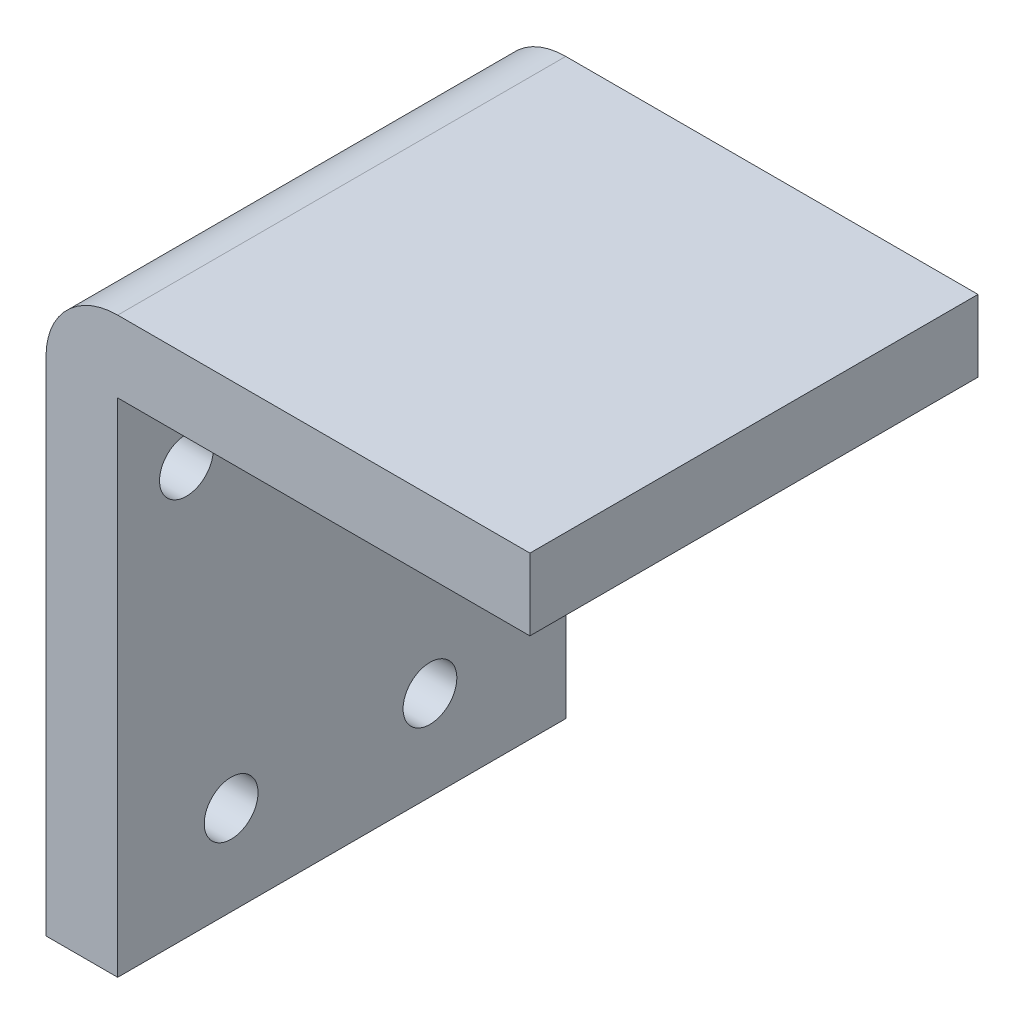
ISO-10303-21;
HEADER;
FILE_DESCRIPTION(('STEP AP214'),'2;1');
FILE_NAME('part.step','',(''),(''),'','','');
FILE_SCHEMA(('AUTOMOTIVE_DESIGN { 1 0 10303 214 1 1 1 1 }'));
ENDSEC;
DATA;
#1=APPLICATION_CONTEXT('core data for automotive mechanical design processes');
#2=APPLICATION_PROTOCOL_DEFINITION('international standard','automotive_design',2000,#1);
#3=PRODUCT_CONTEXT('',#1,'mechanical');
#4=PRODUCT('Part','Part','',(#3));
#5=PRODUCT_RELATED_PRODUCT_CATEGORY('part','',(#4));
#6=PRODUCT_DEFINITION_FORMATION('','',#4);
#7=PRODUCT_DEFINITION_CONTEXT('part definition',#1,'design');
#8=PRODUCT_DEFINITION('design','',#6,#7);
#9=PRODUCT_DEFINITION_SHAPE('','',#8);
#10=(LENGTH_UNIT() NAMED_UNIT(*) SI_UNIT(.MILLI.,.METRE.));
#11=(NAMED_UNIT(*) PLANE_ANGLE_UNIT() SI_UNIT($,.RADIAN.));
#12=(NAMED_UNIT(*) SI_UNIT($,.STERADIAN.) SOLID_ANGLE_UNIT());
#13=UNCERTAINTY_MEASURE_WITH_UNIT(LENGTH_MEASURE(1.E-05),#10,'distance_accuracy_value','');
#14=(GEOMETRIC_REPRESENTATION_CONTEXT(3) GLOBAL_UNCERTAINTY_ASSIGNED_CONTEXT((#13)) GLOBAL_UNIT_ASSIGNED_CONTEXT((#10,
#11,#12)) REPRESENTATION_CONTEXT('',''));
#15=CARTESIAN_POINT('',(0.,0.,0.));
#16=DIRECTION('',(0.,0.,1.));
#17=DIRECTION('',(1.,0.,0.));
#18=AXIS2_PLACEMENT_3D('',#15,#16,#17);
#19=CARTESIAN_POINT('',(8.,-8.,100.));
#20=DIRECTION('',(0.,0.,-1.));
#21=DIRECTION('',(-1.,0.,0.));
#22=AXIS2_PLACEMENT_3D('',#19,#20,#21);
#23=CYLINDRICAL_SURFACE('',#22,16.);
#24=CARTESIAN_POINT('',(8.,-8.,0.));
#25=DIRECTION('',(0.,0.,1.));
#26=DIRECTION('',(1.,0.,0.));
#27=AXIS2_PLACEMENT_3D('',#24,#25,#26);
#28=CIRCLE('',#27,16.);
#29=CARTESIAN_POINT('',(8.00000000000011,8.,0.));
#30=VERTEX_POINT('',#29);
#31=CARTESIAN_POINT('',(-8.,-8.00000000000006,0.));
#32=VERTEX_POINT('',#31);
#33=EDGE_CURVE('E124',#30,#32,#28,.T.);
#34=ORIENTED_EDGE('',*,*,#33,.T.);
#35=DIRECTION('',(0.,0.,-1.));
#36=VECTOR('',#35,1.);
#37=CARTESIAN_POINT('',(-8.,-8.00000000000006,100.));
#38=LINE('',#37,#36);
#39=CARTESIAN_POINT('',(-8.,-8.00000000000006,100.));
#40=VERTEX_POINT('',#39);
#41=EDGE_CURVE('E11',#40,#32,#38,.T.);
#42=ORIENTED_EDGE('',*,*,#41,.F.);
#43=CARTESIAN_POINT('',(8.,-8.,100.));
#44=DIRECTION('',(0.,0.,1.));
#45=DIRECTION('',(1.,0.,0.));
#46=AXIS2_PLACEMENT_3D('',#43,#44,#45);
#47=CIRCLE('',#46,16.);
#48=CARTESIAN_POINT('',(8.00000000000011,8.,100.));
#49=VERTEX_POINT('',#48);
#50=EDGE_CURVE('E142',#49,#40,#47,.T.);
#51=ORIENTED_EDGE('',*,*,#50,.F.);
#52=DIRECTION('',(0.,0.,-1.));
#53=VECTOR('',#52,1.);
#54=CARTESIAN_POINT('',(8.00000000000011,8.,100.));
#55=LINE('',#54,#53);
#56=EDGE_CURVE('E49',#49,#30,#55,.T.);
#57=ORIENTED_EDGE('',*,*,#56,.T.);
#58=EDGE_LOOP('',(#34,#42,#51,#57));
#59=FACE_BOUND('',#58,.T.);
#60=ADVANCED_FACE('F33',(#59),#23,.T.);
#61=CARTESIAN_POINT('',(-8.,-8.00000000000006,100.));
#62=DIRECTION('',(1.,0.,0.));
#63=DIRECTION('',(0.,0.,-1.));
#64=AXIS2_PLACEMENT_3D('',#61,#62,#63);
#65=PLANE('',#64);
#66=CARTESIAN_POINT('',(-8.00000000000001,-28.6830626583917,48.3360241213233));
#67=DIRECTION('',(1.,0.,0.));
#68=DIRECTION('',(0.,0.,-1.));
#69=AXIS2_PLACEMENT_3D('',#66,#67,#68);
#70=CIRCLE('',#69,5.99999999999999);
#71=CARTESIAN_POINT('',(-8.00000000000001,-28.6830626583917,42.3360241213233));
#72=VERTEX_POINT('',#71);
#73=EDGE_CURVE('E168',#72,#72,#70,.T.);
#74=ORIENTED_EDGE('',*,*,#73,.T.);
#75=EDGE_LOOP('',(#74));
#76=FACE_BOUND('',#75,.T.);
#77=CARTESIAN_POINT('',(-8.00000000000001,-28.6830626583917,15.3338358609028));
#78=DIRECTION('',(1.,0.,0.));
#79=DIRECTION('',(0.,0.,-1.));
#80=AXIS2_PLACEMENT_3D('',#77,#78,#79);
#81=CIRCLE('',#80,6.);
#82=CARTESIAN_POINT('',(-8.00000000000001,-28.6830626583917,9.33383586090281));
#83=VERTEX_POINT('',#82);
#84=EDGE_CURVE('E171',#83,#83,#81,.T.);
#85=ORIENTED_EDGE('',*,*,#84,.T.);
#86=EDGE_LOOP('',(#85));
#87=FACE_BOUND('',#86,.T.);
#88=CARTESIAN_POINT('',(-8.00000000000001,-99.9566961283755,74.6823088670372));
#89=DIRECTION('',(1.,0.,0.));
#90=DIRECTION('',(0.,0.,-1.));
#91=AXIS2_PLACEMENT_3D('',#88,#89,#90);
#92=CIRCLE('',#91,6.);
#93=CARTESIAN_POINT('',(-8.00000000000001,-99.9566961283755,68.6823088670372));
#94=VERTEX_POINT('',#93);
#95=EDGE_CURVE('E174',#94,#94,#92,.T.);
#96=ORIENTED_EDGE('',*,*,#95,.T.);
#97=EDGE_LOOP('',(#96));
#98=FACE_BOUND('',#97,.T.);
#99=CARTESIAN_POINT('',(-8.00000000000001,-99.9566961283755,30.3096187689928));
#100=DIRECTION('',(1.,0.,0.));
#101=DIRECTION('',(0.,0.,-1.));
#102=AXIS2_PLACEMENT_3D('',#99,#100,#101);
#103=CIRCLE('',#102,6.);
#104=CARTESIAN_POINT('',(-8.00000000000001,-99.9566961283755,24.3096187689928));
#105=VERTEX_POINT('',#104);
#106=EDGE_CURVE('E177',#105,#105,#103,.T.);
#107=ORIENTED_EDGE('',*,*,#106,.T.);
#108=EDGE_LOOP('',(#107));
#109=FACE_BOUND('',#108,.T.);
#110=CARTESIAN_POINT('',(-8.00000000000001,-28.6830626583917,84.6661641390971));
#111=DIRECTION('',(1.,0.,0.));
#112=DIRECTION('',(0.,0.,-1.));
#113=AXIS2_PLACEMENT_3D('',#110,#111,#112);
#114=CIRCLE('',#113,6.);
#115=CARTESIAN_POINT('',(-8.00000000000001,-28.6830626583917,78.6661641390971));
#116=VERTEX_POINT('',#115);
#117=EDGE_CURVE('E127',#116,#116,#114,.T.);
#118=ORIENTED_EDGE('',*,*,#117,.T.);
#119=EDGE_LOOP('',(#118));
#120=FACE_BOUND('',#119,.T.);
#121=DIRECTION('',(0.,-1.,0.));
#122=VECTOR('',#121,1.);
#123=CARTESIAN_POINT('',(-8.,-8.00000000000006,0.));
#124=LINE('',#123,#122);
#125=CARTESIAN_POINT('',(-8.,-120.,0.));
#126=VERTEX_POINT('',#125);
#127=EDGE_CURVE('E126',#32,#126,#124,.T.);
#128=ORIENTED_EDGE('',*,*,#127,.T.);
#129=DIRECTION('',(0.,0.,-1.));
#130=VECTOR('',#129,1.);
#131=CARTESIAN_POINT('',(-8.,-120.,100.));
#132=LINE('',#131,#130);
#133=CARTESIAN_POINT('',(-8.,-120.,100.));
#134=VERTEX_POINT('',#133);
#135=EDGE_CURVE('E41',#134,#126,#132,.T.);
#136=ORIENTED_EDGE('',*,*,#135,.F.);
#137=DIRECTION('',(0.,-1.,0.));
#138=VECTOR('',#137,1.);
#139=CARTESIAN_POINT('',(-8.,-8.00000000000006,100.));
#140=LINE('',#139,#138);
#141=EDGE_CURVE('E85',#40,#134,#140,.T.);
#142=ORIENTED_EDGE('',*,*,#141,.F.);
#143=ORIENTED_EDGE('',*,*,#41,.T.);
#144=EDGE_LOOP('',(#128,#136,#142,#143));
#145=FACE_BOUND('',#144,.T.);
#146=ADVANCED_FACE('F152',(#76,#87,#98,#109,#120,#145),#65,.F.);
#147=CARTESIAN_POINT('',(8.,-120.,100.));
#148=DIRECTION('',(0.,-1.,0.));
#149=DIRECTION('',(0.,0.,-1.));
#150=AXIS2_PLACEMENT_3D('',#147,#148,#149);
#151=PLANE('',#150);
#152=DIRECTION('',(-1.,0.,0.));
#153=VECTOR('',#152,1.);
#154=CARTESIAN_POINT('',(8.,-120.,0.));
#155=LINE('',#154,#153);
#156=CARTESIAN_POINT('',(8.,-120.,0.));
#157=VERTEX_POINT('',#156);
#158=EDGE_CURVE('E130',#157,#126,#155,.T.);
#159=ORIENTED_EDGE('',*,*,#158,.F.);
#160=DIRECTION('',(0.,0.,-1.));
#161=VECTOR('',#160,1.);
#162=CARTESIAN_POINT('',(8.,-120.,100.));
#163=LINE('',#162,#161);
#164=CARTESIAN_POINT('',(8.,-120.,100.));
#165=VERTEX_POINT('',#164);
#166=EDGE_CURVE('E146',#165,#157,#163,.T.);
#167=ORIENTED_EDGE('',*,*,#166,.F.);
#168=DIRECTION('',(-1.,0.,0.));
#169=VECTOR('',#168,1.);
#170=CARTESIAN_POINT('',(8.,-120.,100.));
#171=LINE('',#170,#169);
#172=EDGE_CURVE('E151',#165,#134,#171,.T.);
#173=ORIENTED_EDGE('',*,*,#172,.T.);
#174=ORIENTED_EDGE('',*,*,#135,.T.);
#175=EDGE_LOOP('',(#159,#167,#173,#174));
#176=FACE_BOUND('',#175,.T.);
#177=ADVANCED_FACE('F150',(#176),#151,.T.);
#178=CARTESIAN_POINT('',(8.,-8.00000000000006,100.));
#179=DIRECTION('',(1.,0.,0.));
#180=DIRECTION('',(0.,0.,-1.));
#181=AXIS2_PLACEMENT_3D('',#178,#179,#180);
#182=PLANE('',#181);
#183=CARTESIAN_POINT('',(8.,-28.6830626583917,48.3360241213233));
#184=DIRECTION('',(1.,0.,0.));
#185=DIRECTION('',(0.,0.,-1.));
#186=AXIS2_PLACEMENT_3D('',#183,#184,#185);
#187=CIRCLE('',#186,5.99999999999999);
#188=CARTESIAN_POINT('',(8.,-28.6830626583917,42.3360241213233));
#189=VERTEX_POINT('',#188);
#190=EDGE_CURVE('E180',#189,#189,#187,.T.);
#191=ORIENTED_EDGE('',*,*,#190,.F.);
#192=EDGE_LOOP('',(#191));
#193=FACE_BOUND('',#192,.T.);
#194=CARTESIAN_POINT('',(8.,-28.6830626583917,15.3338358609028));
#195=DIRECTION('',(1.,0.,0.));
#196=DIRECTION('',(0.,0.,-1.));
#197=AXIS2_PLACEMENT_3D('',#194,#195,#196);
#198=CIRCLE('',#197,6.);
#199=CARTESIAN_POINT('',(8.,-28.6830626583917,9.33383586090281));
#200=VERTEX_POINT('',#199);
#201=EDGE_CURVE('E187',#200,#200,#198,.T.);
#202=ORIENTED_EDGE('',*,*,#201,.F.);
#203=EDGE_LOOP('',(#202));
#204=FACE_BOUND('',#203,.T.);
#205=CARTESIAN_POINT('',(8.,-99.9566961283755,74.6823088670372));
#206=DIRECTION('',(1.,0.,0.));
#207=DIRECTION('',(0.,0.,-1.));
#208=AXIS2_PLACEMENT_3D('',#205,#206,#207);
#209=CIRCLE('',#208,6.);
#210=CARTESIAN_POINT('',(8.,-99.9566961283755,68.6823088670372));
#211=VERTEX_POINT('',#210);
#212=EDGE_CURVE('E184',#211,#211,#209,.T.);
#213=ORIENTED_EDGE('',*,*,#212,.F.);
#214=EDGE_LOOP('',(#213));
#215=FACE_BOUND('',#214,.T.);
#216=CARTESIAN_POINT('',(8.,-99.9566961283755,30.3096187689928));
#217=DIRECTION('',(1.,0.,0.));
#218=DIRECTION('',(0.,0.,-1.));
#219=AXIS2_PLACEMENT_3D('',#216,#217,#218);
#220=CIRCLE('',#219,6.);
#221=CARTESIAN_POINT('',(8.,-99.9566961283755,24.3096187689928));
#222=VERTEX_POINT('',#221);
#223=EDGE_CURVE('E181',#222,#222,#220,.T.);
#224=ORIENTED_EDGE('',*,*,#223,.F.);
#225=EDGE_LOOP('',(#224));
#226=FACE_BOUND('',#225,.T.);
#227=CARTESIAN_POINT('',(8.,-28.6830626583917,84.6661641390971));
#228=DIRECTION('',(1.,0.,0.));
#229=DIRECTION('',(0.,0.,-1.));
#230=AXIS2_PLACEMENT_3D('',#227,#228,#229);
#231=CIRCLE('',#230,6.);
#232=CARTESIAN_POINT('',(8.,-28.6830626583917,78.6661641390971));
#233=VERTEX_POINT('',#232);
#234=EDGE_CURVE('E165',#233,#233,#231,.T.);
#235=ORIENTED_EDGE('',*,*,#234,.F.);
#236=EDGE_LOOP('',(#235));
#237=FACE_BOUND('',#236,.T.);
#238=DIRECTION('',(0.,-1.,0.));
#239=VECTOR('',#238,1.);
#240=CARTESIAN_POINT('',(8.,-8.00000000000006,0.));
#241=LINE('',#240,#239);
#242=CARTESIAN_POINT('',(8.,-8.00000000000006,0.));
#243=VERTEX_POINT('',#242);
#244=EDGE_CURVE('E133',#243,#157,#241,.T.);
#245=ORIENTED_EDGE('',*,*,#244,.F.);
#246=DIRECTION('',(0.,0.,-1.));
#247=VECTOR('',#246,1.);
#248=CARTESIAN_POINT('',(8.,-8.00000000000006,100.));
#249=LINE('',#248,#247);
#250=CARTESIAN_POINT('',(8.,-8.00000000000006,100.));
#251=VERTEX_POINT('',#250);
#252=EDGE_CURVE('E116',#251,#243,#249,.T.);
#253=ORIENTED_EDGE('',*,*,#252,.F.);
#254=DIRECTION('',(0.,-1.,0.));
#255=VECTOR('',#254,1.);
#256=CARTESIAN_POINT('',(8.,-8.00000000000006,100.));
#257=LINE('',#256,#255);
#258=EDGE_CURVE('E106',#251,#165,#257,.T.);
#259=ORIENTED_EDGE('',*,*,#258,.T.);
#260=ORIENTED_EDGE('',*,*,#166,.T.);
#261=EDGE_LOOP('',(#245,#253,#259,#260));
#262=FACE_BOUND('',#261,.T.);
#263=ADVANCED_FACE('F158',(#193,#204,#215,#226,#237,#262),#182,.T.);
#264=CARTESIAN_POINT('',(8.,-8.00000000000006,100.));
#265=DIRECTION('',(0.,1.,0.));
#266=DIRECTION('',(-1.,0.,0.));
#267=AXIS2_PLACEMENT_3D('',#264,#265,#266);
#268=PLANE('',#267);
#269=DIRECTION('',(1.,0.,0.));
#270=VECTOR('',#269,1.);
#271=CARTESIAN_POINT('',(8.,-8.00000000000006,0.));
#272=LINE('',#271,#270);
#273=CARTESIAN_POINT('',(100.,-8.,0.));
#274=VERTEX_POINT('',#273);
#275=EDGE_CURVE('E113',#243,#274,#272,.T.);
#276=ORIENTED_EDGE('',*,*,#275,.T.);
#277=DIRECTION('',(0.,0.,-1.));
#278=VECTOR('',#277,1.);
#279=CARTESIAN_POINT('',(100.,-8.,100.));
#280=LINE('',#279,#278);
#281=CARTESIAN_POINT('',(100.,-8.,100.));
#282=VERTEX_POINT('',#281);
#283=EDGE_CURVE('E110',#282,#274,#280,.T.);
#284=ORIENTED_EDGE('',*,*,#283,.F.);
#285=DIRECTION('',(1.,0.,0.));
#286=VECTOR('',#285,1.);
#287=CARTESIAN_POINT('',(8.,-8.00000000000006,100.));
#288=LINE('',#287,#286);
#289=EDGE_CURVE('E98',#251,#282,#288,.T.);
#290=ORIENTED_EDGE('',*,*,#289,.F.);
#291=ORIENTED_EDGE('',*,*,#252,.T.);
#292=EDGE_LOOP('',(#276,#284,#290,#291));
#293=FACE_BOUND('',#292,.T.);
#294=ADVANCED_FACE('F111',(#293),#268,.F.);
#295=CARTESIAN_POINT('',(100.,-8.,100.));
#296=DIRECTION('',(-1.,0.,0.));
#297=DIRECTION('',(0.,0.,1.));
#298=AXIS2_PLACEMENT_3D('',#295,#296,#297);
#299=PLANE('',#298);
#300=DIRECTION('',(0.,1.,0.));
#301=VECTOR('',#300,1.);
#302=CARTESIAN_POINT('',(100.,-8.,0.));
#303=LINE('',#302,#301);
#304=CARTESIAN_POINT('',(100.,8.,0.));
#305=VERTEX_POINT('',#304);
#306=EDGE_CURVE('E137',#274,#305,#303,.T.);
#307=ORIENTED_EDGE('',*,*,#306,.T.);
#308=DIRECTION('',(0.,0.,-1.));
#309=VECTOR('',#308,1.);
#310=CARTESIAN_POINT('',(100.,8.,100.));
#311=LINE('',#310,#309);
#312=CARTESIAN_POINT('',(100.,8.,100.));
#313=VERTEX_POINT('',#312);
#314=EDGE_CURVE('E73',#313,#305,#311,.T.);
#315=ORIENTED_EDGE('',*,*,#314,.F.);
#316=DIRECTION('',(0.,1.,0.));
#317=VECTOR('',#316,1.);
#318=CARTESIAN_POINT('',(100.,-8.,100.));
#319=LINE('',#318,#317);
#320=EDGE_CURVE('E103',#282,#313,#319,.T.);
#321=ORIENTED_EDGE('',*,*,#320,.F.);
#322=ORIENTED_EDGE('',*,*,#283,.T.);
#323=EDGE_LOOP('',(#307,#315,#321,#322));
#324=FACE_BOUND('',#323,.T.);
#325=ADVANCED_FACE('F118',(#324),#299,.F.);
#326=CARTESIAN_POINT('',(8.00000000000011,8.,100.));
#327=DIRECTION('',(0.,1.,0.));
#328=DIRECTION('',(-1.,0.,0.));
#329=AXIS2_PLACEMENT_3D('',#326,#327,#328);
#330=PLANE('',#329);
#331=DIRECTION('',(1.,0.,0.));
#332=VECTOR('',#331,1.);
#333=CARTESIAN_POINT('',(8.00000000000011,8.,0.));
#334=LINE('',#333,#332);
#335=EDGE_CURVE('E139',#30,#305,#334,.T.);
#336=ORIENTED_EDGE('',*,*,#335,.F.);
#337=ORIENTED_EDGE('',*,*,#56,.F.);
#338=DIRECTION('',(1.,0.,0.));
#339=VECTOR('',#338,1.);
#340=CARTESIAN_POINT('',(8.00000000000011,8.,100.));
#341=LINE('',#340,#339);
#342=EDGE_CURVE('E119',#49,#313,#341,.T.);
#343=ORIENTED_EDGE('',*,*,#342,.T.);
#344=ORIENTED_EDGE('',*,*,#314,.T.);
#345=EDGE_LOOP('',(#336,#337,#343,#344));
#346=FACE_BOUND('',#345,.T.);
#347=ADVANCED_FACE('F228',(#346),#330,.T.);
#348=CARTESIAN_POINT('',(8.,-8.,100.));
#349=DIRECTION('',(0.,0.,1.));
#350=DIRECTION('',(1.,0.,0.));
#351=AXIS2_PLACEMENT_3D('',#348,#349,#350);
#352=PLANE('',#351);
#353=ORIENTED_EDGE('',*,*,#50,.T.);
#354=ORIENTED_EDGE('',*,*,#141,.T.);
#355=ORIENTED_EDGE('',*,*,#172,.F.);
#356=ORIENTED_EDGE('',*,*,#258,.F.);
#357=ORIENTED_EDGE('',*,*,#289,.T.);
#358=ORIENTED_EDGE('',*,*,#320,.T.);
#359=ORIENTED_EDGE('',*,*,#342,.F.);
#360=EDGE_LOOP('',(#353,#354,#355,#356,#357,#358,#359));
#361=FACE_BOUND('',#360,.T.);
#362=ADVANCED_FACE('F100',(#361),#352,.T.);
#363=CARTESIAN_POINT('',(8.,-8.,0.));
#364=DIRECTION('',(0.,0.,1.));
#365=DIRECTION('',(1.,0.,0.));
#366=AXIS2_PLACEMENT_3D('',#363,#364,#365);
#367=PLANE('',#366);
#368=ORIENTED_EDGE('',*,*,#33,.F.);
#369=ORIENTED_EDGE('',*,*,#335,.T.);
#370=ORIENTED_EDGE('',*,*,#306,.F.);
#371=ORIENTED_EDGE('',*,*,#275,.F.);
#372=ORIENTED_EDGE('',*,*,#244,.T.);
#373=ORIENTED_EDGE('',*,*,#158,.T.);
#374=ORIENTED_EDGE('',*,*,#127,.F.);
#375=EDGE_LOOP('',(#368,#369,#370,#371,#372,#373,#374));
#376=FACE_BOUND('',#375,.T.);
#377=ADVANCED_FACE('F155',(#376),#367,.F.);
#378=CARTESIAN_POINT('',(-92.,-28.6830626583917,84.6661641390971));
#379=DIRECTION('',(1.,0.,0.));
#380=DIRECTION('',(0.,0.,-1.));
#381=AXIS2_PLACEMENT_3D('',#378,#379,#380);
#382=CYLINDRICAL_SURFACE('',#381,6.);
#383=ORIENTED_EDGE('',*,*,#234,.T.);
#384=EDGE_LOOP('',(#383));
#385=FACE_BOUND('',#384,.T.);
#386=ORIENTED_EDGE('',*,*,#117,.F.);
#387=EDGE_LOOP('',(#386));
#388=FACE_BOUND('',#387,.T.);
#389=ADVANCED_FACE('F207',(#385,#388),#382,.F.);
#390=CARTESIAN_POINT('',(-92.,-99.9566961283755,30.3096187689928));
#391=DIRECTION('',(1.,0.,0.));
#392=DIRECTION('',(0.,0.,-1.));
#393=AXIS2_PLACEMENT_3D('',#390,#391,#392);
#394=CYLINDRICAL_SURFACE('',#393,6.);
#395=ORIENTED_EDGE('',*,*,#223,.T.);
#396=EDGE_LOOP('',(#395));
#397=FACE_BOUND('',#396,.T.);
#398=ORIENTED_EDGE('',*,*,#106,.F.);
#399=EDGE_LOOP('',(#398));
#400=FACE_BOUND('',#399,.T.);
#401=ADVANCED_FACE('F210',(#397,#400),#394,.F.);
#402=CARTESIAN_POINT('',(-92.,-99.9566961283755,74.6823088670372));
#403=DIRECTION('',(1.,0.,0.));
#404=DIRECTION('',(0.,0.,-1.));
#405=AXIS2_PLACEMENT_3D('',#402,#403,#404);
#406=CYLINDRICAL_SURFACE('',#405,6.);
#407=ORIENTED_EDGE('',*,*,#212,.T.);
#408=EDGE_LOOP('',(#407));
#409=FACE_BOUND('',#408,.T.);
#410=ORIENTED_EDGE('',*,*,#95,.F.);
#411=EDGE_LOOP('',(#410));
#412=FACE_BOUND('',#411,.T.);
#413=ADVANCED_FACE('F237',(#409,#412),#406,.F.);
#414=CARTESIAN_POINT('',(-92.,-28.6830626583917,15.3338358609028));
#415=DIRECTION('',(1.,0.,0.));
#416=DIRECTION('',(0.,0.,-1.));
#417=AXIS2_PLACEMENT_3D('',#414,#415,#416);
#418=CYLINDRICAL_SURFACE('',#417,6.);
#419=ORIENTED_EDGE('',*,*,#201,.T.);
#420=EDGE_LOOP('',(#419));
#421=FACE_BOUND('',#420,.T.);
#422=ORIENTED_EDGE('',*,*,#84,.F.);
#423=EDGE_LOOP('',(#422));
#424=FACE_BOUND('',#423,.T.);
#425=ADVANCED_FACE('F241',(#421,#424),#418,.F.);
#426=CARTESIAN_POINT('',(-92.,-28.6830626583917,48.3360241213233));
#427=DIRECTION('',(1.,0.,0.));
#428=DIRECTION('',(0.,0.,-1.));
#429=AXIS2_PLACEMENT_3D('',#426,#427,#428);
#430=CYLINDRICAL_SURFACE('',#429,5.99999999999999);
#431=ORIENTED_EDGE('',*,*,#190,.T.);
#432=EDGE_LOOP('',(#431));
#433=FACE_BOUND('',#432,.T.);
#434=ORIENTED_EDGE('',*,*,#73,.F.);
#435=EDGE_LOOP('',(#434));
#436=FACE_BOUND('',#435,.T.);
#437=ADVANCED_FACE('F193',(#433,#436),#430,.F.);
#438=CLOSED_SHELL('',(#60,#146,#177,#263,#294,#325,#347,#362,#377,#389,#401,#413,#425,#437));
#439=MANIFOLD_SOLID_BREP('B2',#438);
#440=ADVANCED_BREP_SHAPE_REPRESENTATION('',(#18,#439),#14);
#441=SHAPE_DEFINITION_REPRESENTATION(#9,#440);
ENDSEC;
END-ISO-10303-21;
